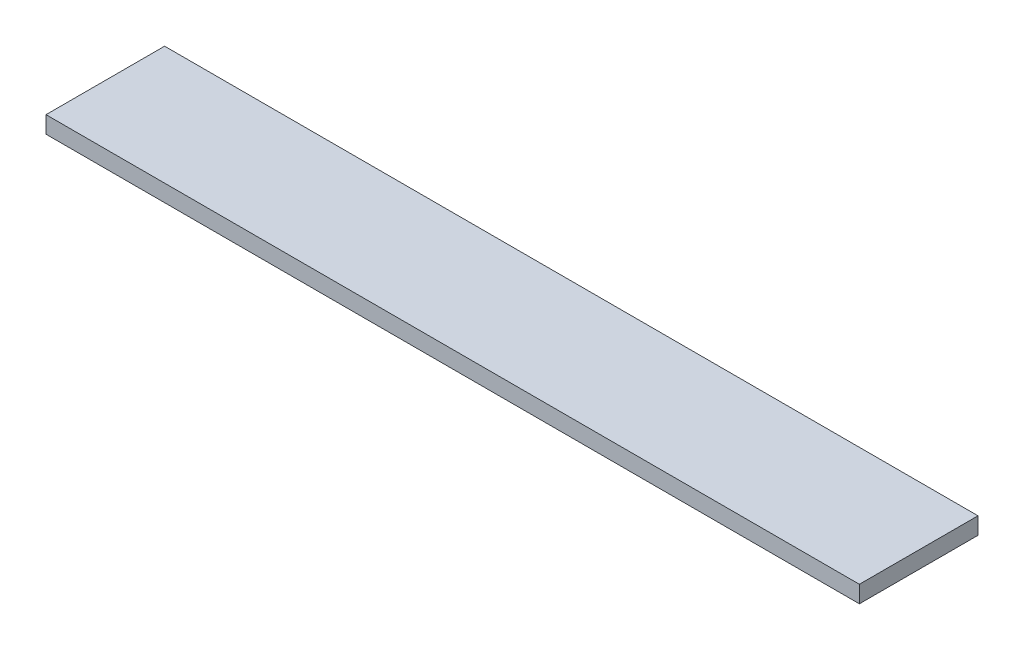
ISO-10303-21;
HEADER;
FILE_DESCRIPTION(('STEP AP214'),'2;1');
FILE_NAME('part.step','',(''),(''),'','','');
FILE_SCHEMA(('AUTOMOTIVE_DESIGN { 1 0 10303 214 1 1 1 1 }'));
ENDSEC;
DATA;
#1=APPLICATION_CONTEXT('core data for automotive mechanical design processes');
#2=APPLICATION_PROTOCOL_DEFINITION('international standard','automotive_design',2000,#1);
#3=PRODUCT_CONTEXT('',#1,'mechanical');
#4=PRODUCT('Part','Part','',(#3));
#5=PRODUCT_RELATED_PRODUCT_CATEGORY('part','',(#4));
#6=PRODUCT_DEFINITION_FORMATION('','',#4);
#7=PRODUCT_DEFINITION_CONTEXT('part definition',#1,'design');
#8=PRODUCT_DEFINITION('design','',#6,#7);
#9=PRODUCT_DEFINITION_SHAPE('','',#8);
#10=(LENGTH_UNIT() NAMED_UNIT(*) SI_UNIT(.MILLI.,.METRE.));
#11=(NAMED_UNIT(*) PLANE_ANGLE_UNIT() SI_UNIT($,.RADIAN.));
#12=(NAMED_UNIT(*) SI_UNIT($,.STERADIAN.) SOLID_ANGLE_UNIT());
#13=UNCERTAINTY_MEASURE_WITH_UNIT(LENGTH_MEASURE(1.E-05),#10,'distance_accuracy_value','');
#14=(GEOMETRIC_REPRESENTATION_CONTEXT(3) GLOBAL_UNCERTAINTY_ASSIGNED_CONTEXT((#13)) GLOBAL_UNIT_ASSIGNED_CONTEXT((#10,
#11,#12)) REPRESENTATION_CONTEXT('',''));
#15=CARTESIAN_POINT('',(0.,0.,0.));
#16=DIRECTION('',(0.,0.,1.));
#17=DIRECTION('',(1.,0.,0.));
#18=AXIS2_PLACEMENT_3D('',#15,#16,#17);
#19=CARTESIAN_POINT('',(-304.8,12.7,88.9000000000001));
#20=DIRECTION('',(1.,0.,0.));
#21=DIRECTION('',(0.,0.,-1.));
#22=AXIS2_PLACEMENT_3D('',#19,#20,#21);
#23=PLANE('',#22);
#24=DIRECTION('',(0.,0.,1.));
#25=VECTOR('',#24,1.);
#26=CARTESIAN_POINT('',(-304.8,0.,88.9000000000001));
#27=LINE('',#26,#25);
#28=CARTESIAN_POINT('',(-304.8,0.,0.));
#29=VERTEX_POINT('',#28);
#30=CARTESIAN_POINT('',(-304.8,0.,88.9000000000001));
#31=VERTEX_POINT('',#30);
#32=EDGE_CURVE('E92',#29,#31,#27,.T.);
#33=ORIENTED_EDGE('',*,*,#32,.T.);
#34=DIRECTION('',(0.,-1.,0.));
#35=VECTOR('',#34,1.);
#36=CARTESIAN_POINT('',(-304.8,12.7,88.9000000000001));
#37=LINE('',#36,#35);
#38=CARTESIAN_POINT('',(-304.8,12.7,88.9000000000001));
#39=VERTEX_POINT('',#38);
#40=EDGE_CURVE('E11',#39,#31,#37,.T.);
#41=ORIENTED_EDGE('',*,*,#40,.F.);
#42=DIRECTION('',(0.,0.,1.));
#43=VECTOR('',#42,1.);
#44=CARTESIAN_POINT('',(-304.8,12.7,88.9000000000001));
#45=LINE('',#44,#43);
#46=CARTESIAN_POINT('',(-304.8,12.7,0.));
#47=VERTEX_POINT('',#46);
#48=EDGE_CURVE('E80',#47,#39,#45,.T.);
#49=ORIENTED_EDGE('',*,*,#48,.F.);
#50=DIRECTION('',(0.,-1.,0.));
#51=VECTOR('',#50,1.);
#52=CARTESIAN_POINT('',(-304.8,12.7,0.));
#53=LINE('',#52,#51);
#54=EDGE_CURVE('E88',#47,#29,#53,.T.);
#55=ORIENTED_EDGE('',*,*,#54,.T.);
#56=EDGE_LOOP('',(#33,#41,#49,#55));
#57=FACE_BOUND('',#56,.T.);
#58=ADVANCED_FACE('F29',(#57),#23,.F.);
#59=CARTESIAN_POINT('',(304.8,12.7,88.9000000000001));
#60=DIRECTION('',(0.,0.,-1.));
#61=DIRECTION('',(-1.,0.,0.));
#62=AXIS2_PLACEMENT_3D('',#59,#60,#61);
#63=PLANE('',#62);
#64=DIRECTION('',(1.,0.,0.));
#65=VECTOR('',#64,1.);
#66=CARTESIAN_POINT('',(304.8,0.,88.9000000000001));
#67=LINE('',#66,#65);
#68=CARTESIAN_POINT('',(304.8,0.,88.9000000000001));
#69=VERTEX_POINT('',#68);
#70=EDGE_CURVE('E84',#31,#69,#67,.T.);
#71=ORIENTED_EDGE('',*,*,#70,.T.);
#72=DIRECTION('',(0.,-1.,0.));
#73=VECTOR('',#72,1.);
#74=CARTESIAN_POINT('',(304.8,12.7,88.9000000000001));
#75=LINE('',#74,#73);
#76=CARTESIAN_POINT('',(304.8,12.7,88.9000000000001));
#77=VERTEX_POINT('',#76);
#78=EDGE_CURVE('E37',#77,#69,#75,.T.);
#79=ORIENTED_EDGE('',*,*,#78,.F.);
#80=DIRECTION('',(1.,0.,0.));
#81=VECTOR('',#80,1.);
#82=CARTESIAN_POINT('',(304.8,12.7,88.9000000000001));
#83=LINE('',#82,#81);
#84=EDGE_CURVE('E75',#39,#77,#83,.T.);
#85=ORIENTED_EDGE('',*,*,#84,.F.);
#86=ORIENTED_EDGE('',*,*,#40,.T.);
#87=EDGE_LOOP('',(#71,#79,#85,#86));
#88=FACE_BOUND('',#87,.T.);
#89=ADVANCED_FACE('F83',(#88),#63,.F.);
#90=CARTESIAN_POINT('',(304.8,12.7,88.9000000000001));
#91=DIRECTION('',(-1.,0.,0.));
#92=DIRECTION('',(0.,0.,1.));
#93=AXIS2_PLACEMENT_3D('',#90,#91,#92);
#94=PLANE('',#93);
#95=DIRECTION('',(0.,0.,-1.));
#96=VECTOR('',#95,1.);
#97=CARTESIAN_POINT('',(304.8,0.,88.9000000000001));
#98=LINE('',#97,#96);
#99=CARTESIAN_POINT('',(304.8,0.,0.));
#100=VERTEX_POINT('',#99);
#101=EDGE_CURVE('E62',#69,#100,#98,.T.);
#102=ORIENTED_EDGE('',*,*,#101,.T.);
#103=DIRECTION('',(0.,-1.,0.));
#104=VECTOR('',#103,1.);
#105=CARTESIAN_POINT('',(304.8,12.7,0.));
#106=LINE('',#105,#104);
#107=CARTESIAN_POINT('',(304.8,12.7,0.));
#108=VERTEX_POINT('',#107);
#109=EDGE_CURVE('E85',#108,#100,#106,.T.);
#110=ORIENTED_EDGE('',*,*,#109,.F.);
#111=DIRECTION('',(0.,0.,-1.));
#112=VECTOR('',#111,1.);
#113=CARTESIAN_POINT('',(304.8,12.7,88.9000000000001));
#114=LINE('',#113,#112);
#115=EDGE_CURVE('E78',#77,#108,#114,.T.);
#116=ORIENTED_EDGE('',*,*,#115,.F.);
#117=ORIENTED_EDGE('',*,*,#78,.T.);
#118=EDGE_LOOP('',(#102,#110,#116,#117));
#119=FACE_BOUND('',#118,.T.);
#120=ADVANCED_FACE('F86',(#119),#94,.F.);
#121=CARTESIAN_POINT('',(304.8,12.7,0.));
#122=DIRECTION('',(0.,0.,1.));
#123=DIRECTION('',(1.,0.,0.));
#124=AXIS2_PLACEMENT_3D('',#121,#122,#123);
#125=PLANE('',#124);
#126=DIRECTION('',(-1.,0.,0.));
#127=VECTOR('',#126,1.);
#128=CARTESIAN_POINT('',(304.8,0.,0.));
#129=LINE('',#128,#127);
#130=EDGE_CURVE('E68',#100,#29,#129,.T.);
#131=ORIENTED_EDGE('',*,*,#130,.T.);
#132=ORIENTED_EDGE('',*,*,#54,.F.);
#133=DIRECTION('',(-1.,0.,0.));
#134=VECTOR('',#133,1.);
#135=CARTESIAN_POINT('',(304.8,12.7,0.));
#136=LINE('',#135,#134);
#137=EDGE_CURVE('E45',#108,#47,#136,.T.);
#138=ORIENTED_EDGE('',*,*,#137,.F.);
#139=ORIENTED_EDGE('',*,*,#109,.T.);
#140=EDGE_LOOP('',(#131,#132,#138,#139));
#141=FACE_BOUND('',#140,.T.);
#142=ADVANCED_FACE('F99',(#141),#125,.F.);
#143=CARTESIAN_POINT('',(0.,12.7,0.));
#144=DIRECTION('',(0.,1.,0.));
#145=DIRECTION('',(0.,0.,1.));
#146=AXIS2_PLACEMENT_3D('',#143,#144,#145);
#147=PLANE('',#146);
#148=ORIENTED_EDGE('',*,*,#48,.T.);
#149=ORIENTED_EDGE('',*,*,#84,.T.);
#150=ORIENTED_EDGE('',*,*,#115,.T.);
#151=ORIENTED_EDGE('',*,*,#137,.T.);
#152=EDGE_LOOP('',(#148,#149,#150,#151));
#153=FACE_BOUND('',#152,.T.);
#154=ADVANCED_FACE('F76',(#153),#147,.T.);
#155=CARTESIAN_POINT('',(0.,0.,0.));
#156=DIRECTION('',(0.,1.,0.));
#157=DIRECTION('',(0.,0.,1.));
#158=AXIS2_PLACEMENT_3D('',#155,#156,#157);
#159=PLANE('',#158);
#160=ORIENTED_EDGE('',*,*,#32,.F.);
#161=ORIENTED_EDGE('',*,*,#130,.F.);
#162=ORIENTED_EDGE('',*,*,#101,.F.);
#163=ORIENTED_EDGE('',*,*,#70,.F.);
#164=EDGE_LOOP('',(#160,#161,#162,#163));
#165=FACE_BOUND('',#164,.T.);
#166=ADVANCED_FACE('F102',(#165),#159,.F.);
#167=CLOSED_SHELL('',(#58,#89,#120,#142,#154,#166));
#168=MANIFOLD_SOLID_BREP('B2',#167);
#169=ADVANCED_BREP_SHAPE_REPRESENTATION('',(#18,#168),#14);
#170=SHAPE_DEFINITION_REPRESENTATION(#9,#169);
ENDSEC;
END-ISO-10303-21;
